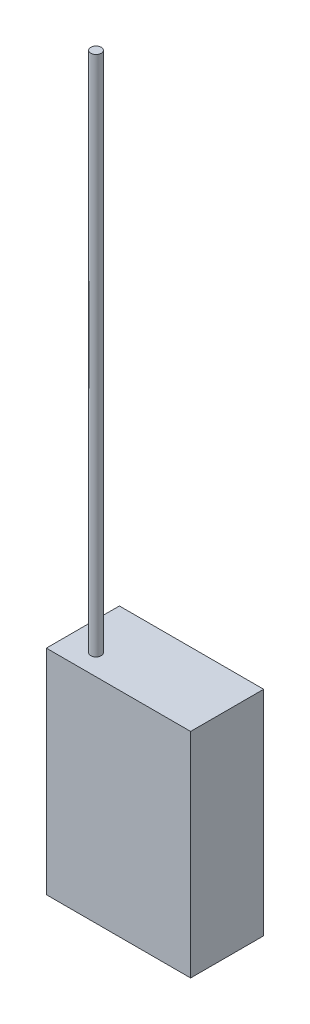
ISO-10303-21;
HEADER;
FILE_DESCRIPTION(('STEP AP214'),'2;1');
FILE_NAME('part.step','',(''),(''),'','','');
FILE_SCHEMA(('AUTOMOTIVE_DESIGN { 1 0 10303 214 1 1 1 1 }'));
ENDSEC;
DATA;
#1=APPLICATION_CONTEXT('core data for automotive mechanical design processes');
#2=APPLICATION_PROTOCOL_DEFINITION('international standard','automotive_design',2000,#1);
#3=PRODUCT_CONTEXT('',#1,'mechanical');
#4=PRODUCT('Part','Part','',(#3));
#5=PRODUCT_RELATED_PRODUCT_CATEGORY('part','',(#4));
#6=PRODUCT_DEFINITION_FORMATION('','',#4);
#7=PRODUCT_DEFINITION_CONTEXT('part definition',#1,'design');
#8=PRODUCT_DEFINITION('design','',#6,#7);
#9=PRODUCT_DEFINITION_SHAPE('','',#8);
#10=(LENGTH_UNIT() NAMED_UNIT(*) SI_UNIT(.MILLI.,.METRE.));
#11=(NAMED_UNIT(*) PLANE_ANGLE_UNIT() SI_UNIT($,.RADIAN.));
#12=(NAMED_UNIT(*) SI_UNIT($,.STERADIAN.) SOLID_ANGLE_UNIT());
#13=UNCERTAINTY_MEASURE_WITH_UNIT(LENGTH_MEASURE(1.E-05),#10,'distance_accuracy_value','');
#14=(GEOMETRIC_REPRESENTATION_CONTEXT(3) GLOBAL_UNCERTAINTY_ASSIGNED_CONTEXT((#13)) GLOBAL_UNIT_ASSIGNED_CONTEXT((#10,
#11,#12)) REPRESENTATION_CONTEXT('',''));
#15=CARTESIAN_POINT('',(0.,0.,0.));
#16=DIRECTION('',(0.,0.,1.));
#17=DIRECTION('',(1.,0.,0.));
#18=AXIS2_PLACEMENT_3D('',#15,#16,#17);
#19=CARTESIAN_POINT('',(-63.0073106843084,12.0199431125403,7.));
#20=DIRECTION('',(1.,0.,0.));
#21=DIRECTION('',(0.,0.,-1.));
#22=AXIS2_PLACEMENT_3D('',#19,#20,#21);
#23=PLANE('',#22);
#24=DIRECTION('',(0.,-1.,0.));
#25=VECTOR('',#24,1.);
#26=CARTESIAN_POINT('',(-63.0073106843084,12.0199431125403,0.));
#27=LINE('',#26,#25);
#28=CARTESIAN_POINT('',(-63.0073106843084,12.0199431125403,0.));
#29=VERTEX_POINT('',#28);
#30=CARTESIAN_POINT('',(-63.0073106843084,-8.44386503348522,0.));
#31=VERTEX_POINT('',#30);
#32=EDGE_CURVE('E99',#29,#31,#27,.T.);
#33=ORIENTED_EDGE('',*,*,#32,.T.);
#34=DIRECTION('',(0.,0.,-1.));
#35=VECTOR('',#34,1.);
#36=CARTESIAN_POINT('',(-63.0073106843084,-8.44386503348522,7.));
#37=LINE('',#36,#35);
#38=CARTESIAN_POINT('',(-63.0073106843084,-8.44386503348522,7.));
#39=VERTEX_POINT('',#38);
#40=EDGE_CURVE('E41',#39,#31,#37,.T.);
#41=ORIENTED_EDGE('',*,*,#40,.F.);
#42=DIRECTION('',(0.,-1.,0.));
#43=VECTOR('',#42,1.);
#44=CARTESIAN_POINT('',(-63.0073106843084,12.0199431125403,7.));
#45=LINE('',#44,#43);
#46=CARTESIAN_POINT('',(-63.0073106843084,12.0199431125403,7.));
#47=VERTEX_POINT('',#46);
#48=EDGE_CURVE('E85',#47,#39,#45,.T.);
#49=ORIENTED_EDGE('',*,*,#48,.F.);
#50=DIRECTION('',(0.,0.,-1.));
#51=VECTOR('',#50,1.);
#52=CARTESIAN_POINT('',(-63.0073106843084,12.0199431125403,7.));
#53=LINE('',#52,#51);
#54=EDGE_CURVE('E95',#47,#29,#53,.T.);
#55=ORIENTED_EDGE('',*,*,#54,.T.);
#56=EDGE_LOOP('',(#33,#41,#49,#55));
#57=FACE_BOUND('',#56,.T.);
#58=ADVANCED_FACE('F33',(#57),#23,.F.);
#59=CARTESIAN_POINT('',(-63.0073106843084,-8.44386503348522,7.));
#60=DIRECTION('',(0.,1.,0.));
#61=DIRECTION('',(0.,0.,1.));
#62=AXIS2_PLACEMENT_3D('',#59,#60,#61);
#63=PLANE('',#62);
#64=DIRECTION('',(1.,0.,0.));
#65=VECTOR('',#64,1.);
#66=CARTESIAN_POINT('',(-63.0073106843084,-8.44386503348522,0.));
#67=LINE('',#66,#65);
#68=CARTESIAN_POINT('',(-49.1804132883452,-8.44386503348522,0.));
#69=VERTEX_POINT('',#68);
#70=EDGE_CURVE('E90',#31,#69,#67,.T.);
#71=ORIENTED_EDGE('',*,*,#70,.T.);
#72=DIRECTION('',(0.,0.,-1.));
#73=VECTOR('',#72,1.);
#74=CARTESIAN_POINT('',(-49.1804132883452,-8.44386503348522,7.));
#75=LINE('',#74,#73);
#76=CARTESIAN_POINT('',(-49.1804132883452,-8.44386503348522,7.));
#77=VERTEX_POINT('',#76);
#78=EDGE_CURVE('E88',#77,#69,#75,.T.);
#79=ORIENTED_EDGE('',*,*,#78,.F.);
#80=DIRECTION('',(1.,0.,0.));
#81=VECTOR('',#80,1.);
#82=CARTESIAN_POINT('',(-63.0073106843084,-8.44386503348522,7.));
#83=LINE('',#82,#81);
#84=EDGE_CURVE('E80',#39,#77,#83,.T.);
#85=ORIENTED_EDGE('',*,*,#84,.F.);
#86=ORIENTED_EDGE('',*,*,#40,.T.);
#87=EDGE_LOOP('',(#71,#79,#85,#86));
#88=FACE_BOUND('',#87,.T.);
#89=ADVANCED_FACE('F89',(#88),#63,.F.);
#90=CARTESIAN_POINT('',(-49.1804132883452,12.0199431125403,7.));
#91=DIRECTION('',(-1.,0.,0.));
#92=DIRECTION('',(0.,0.,1.));
#93=AXIS2_PLACEMENT_3D('',#90,#91,#92);
#94=PLANE('',#93);
#95=DIRECTION('',(0.,1.,0.));
#96=VECTOR('',#95,1.);
#97=CARTESIAN_POINT('',(-49.1804132883452,12.0199431125403,0.));
#98=LINE('',#97,#96);
#99=CARTESIAN_POINT('',(-49.1804132883452,12.0199431125403,0.));
#100=VERTEX_POINT('',#99);
#101=EDGE_CURVE('E66',#69,#100,#98,.T.);
#102=ORIENTED_EDGE('',*,*,#101,.T.);
#103=DIRECTION('',(0.,0.,-1.));
#104=VECTOR('',#103,1.);
#105=CARTESIAN_POINT('',(-49.1804132883452,12.0199431125403,7.));
#106=LINE('',#105,#104);
#107=CARTESIAN_POINT('',(-49.1804132883452,12.0199431125403,7.));
#108=VERTEX_POINT('',#107);
#109=EDGE_CURVE('E91',#108,#100,#106,.T.);
#110=ORIENTED_EDGE('',*,*,#109,.F.);
#111=DIRECTION('',(0.,1.,0.));
#112=VECTOR('',#111,1.);
#113=CARTESIAN_POINT('',(-49.1804132883452,12.0199431125403,7.));
#114=LINE('',#113,#112);
#115=EDGE_CURVE('E83',#77,#108,#114,.T.);
#116=ORIENTED_EDGE('',*,*,#115,.F.);
#117=ORIENTED_EDGE('',*,*,#78,.T.);
#118=EDGE_LOOP('',(#102,#110,#116,#117));
#119=FACE_BOUND('',#118,.T.);
#120=ADVANCED_FACE('F93',(#119),#94,.F.);
#121=CARTESIAN_POINT('',(-63.0073106843084,12.0199431125403,7.));
#122=DIRECTION('',(0.,-1.,0.));
#123=DIRECTION('',(0.,0.,-1.));
#124=AXIS2_PLACEMENT_3D('',#121,#122,#123);
#125=PLANE('',#124);
#126=CARTESIAN_POINT('',(-60.2428950548686,12.0199431125403,5.));
#127=DIRECTION('',(0.,-1.,0.));
#128=DIRECTION('',(0.,0.,-1.));
#129=AXIS2_PLACEMENT_3D('',#126,#127,#128);
#130=CIRCLE('',#129,0.499999999999999);
#131=CARTESIAN_POINT('',(-60.2428950548686,12.0199431125403,4.5));
#132=VERTEX_POINT('',#131);
#133=EDGE_CURVE('E11',#132,#132,#130,.F.);
#134=ORIENTED_EDGE('',*,*,#133,.F.);
#135=EDGE_LOOP('',(#134));
#136=FACE_BOUND('',#135,.T.);
#137=DIRECTION('',(-1.,0.,0.));
#138=VECTOR('',#137,1.);
#139=CARTESIAN_POINT('',(-63.0073106843084,12.0199431125403,0.));
#140=LINE('',#139,#138);
#141=EDGE_CURVE('E72',#100,#29,#140,.T.);
#142=ORIENTED_EDGE('',*,*,#141,.T.);
#143=ORIENTED_EDGE('',*,*,#54,.F.);
#144=DIRECTION('',(-1.,0.,0.));
#145=VECTOR('',#144,1.);
#146=CARTESIAN_POINT('',(-63.0073106843084,12.0199431125403,7.));
#147=LINE('',#146,#145);
#148=EDGE_CURVE('E49',#108,#47,#147,.T.);
#149=ORIENTED_EDGE('',*,*,#148,.F.);
#150=ORIENTED_EDGE('',*,*,#109,.T.);
#151=EDGE_LOOP('',(#142,#143,#149,#150));
#152=FACE_BOUND('',#151,.T.);
#153=ADVANCED_FACE('F121',(#136,#152),#125,.F.);
#154=CARTESIAN_POINT('',(0.,0.,7.));
#155=DIRECTION('',(0.,0.,1.));
#156=DIRECTION('',(1.,0.,0.));
#157=AXIS2_PLACEMENT_3D('',#154,#155,#156);
#158=PLANE('',#157);
#159=ORIENTED_EDGE('',*,*,#48,.T.);
#160=ORIENTED_EDGE('',*,*,#84,.T.);
#161=ORIENTED_EDGE('',*,*,#115,.T.);
#162=ORIENTED_EDGE('',*,*,#148,.T.);
#163=EDGE_LOOP('',(#159,#160,#161,#162));
#164=FACE_BOUND('',#163,.T.);
#165=ADVANCED_FACE('F81',(#164),#158,.T.);
#166=CARTESIAN_POINT('',(0.,0.,0.));
#167=DIRECTION('',(0.,0.,1.));
#168=DIRECTION('',(1.,0.,0.));
#169=AXIS2_PLACEMENT_3D('',#166,#167,#168);
#170=PLANE('',#169);
#171=ORIENTED_EDGE('',*,*,#32,.F.);
#172=ORIENTED_EDGE('',*,*,#141,.F.);
#173=ORIENTED_EDGE('',*,*,#101,.F.);
#174=ORIENTED_EDGE('',*,*,#70,.F.);
#175=EDGE_LOOP('',(#171,#172,#173,#174));
#176=FACE_BOUND('',#175,.T.);
#177=ADVANCED_FACE('F110',(#176),#170,.F.);
#178=CARTESIAN_POINT('',(-60.2428950548686,62.0199431125403,5.));
#179=DIRECTION('',(0.,-1.,0.));
#180=DIRECTION('',(0.,0.,-1.));
#181=AXIS2_PLACEMENT_3D('',#178,#179,#180);
#182=CYLINDRICAL_SURFACE('',#181,0.499999999999999);
#183=CARTESIAN_POINT('',(-60.2428950548686,62.0199431125403,5.));
#184=DIRECTION('',(0.,1.,0.));
#185=DIRECTION('',(0.,0.,1.));
#186=AXIS2_PLACEMENT_3D('',#183,#184,#185);
#187=CIRCLE('',#186,0.499999999999999);
#188=CARTESIAN_POINT('',(-60.2428950548686,62.0199431125403,5.5));
#189=VERTEX_POINT('',#188);
#190=EDGE_CURVE('E102',#189,#189,#187,.T.);
#191=ORIENTED_EDGE('',*,*,#190,.F.);
#192=EDGE_LOOP('',(#191));
#193=FACE_BOUND('',#192,.T.);
#194=ORIENTED_EDGE('',*,*,#133,.T.);
#195=EDGE_LOOP('',(#194));
#196=FACE_BOUND('',#195,.T.);
#197=ADVANCED_FACE('F112',(#193,#196),#182,.T.);
#198=CARTESIAN_POINT('',(-60.2428950548686,62.0199431125403,5.));
#199=DIRECTION('',(0.,1.,0.));
#200=DIRECTION('',(0.,0.,1.));
#201=AXIS2_PLACEMENT_3D('',#198,#199,#200);
#202=PLANE('',#201);
#203=ORIENTED_EDGE('',*,*,#190,.T.);
#204=EDGE_LOOP('',(#203));
#205=FACE_BOUND('',#204,.T.);
#206=ADVANCED_FACE('F118',(#205),#202,.T.);
#207=CLOSED_SHELL('',(#58,#89,#120,#153,#165,#177,#197,#206));
#208=MANIFOLD_SOLID_BREP('B2',#207);
#209=ADVANCED_BREP_SHAPE_REPRESENTATION('',(#18,#208),#14);
#210=SHAPE_DEFINITION_REPRESENTATION(#9,#209);
ENDSEC;
END-ISO-10303-21;
